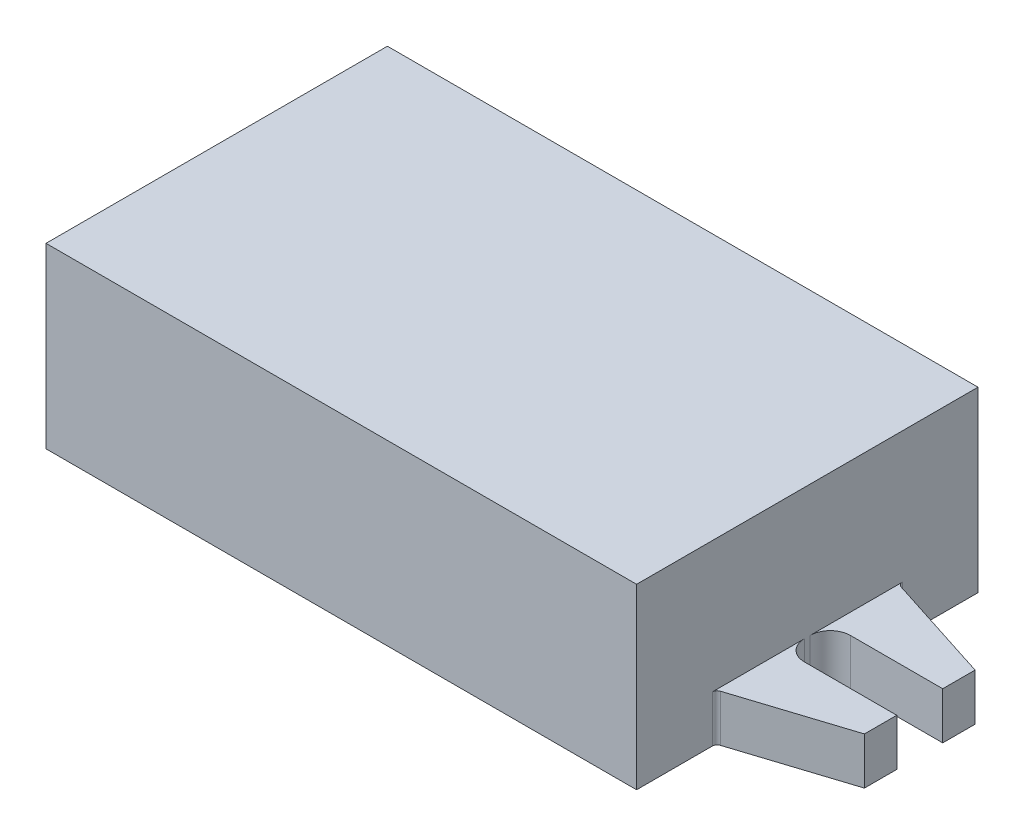
ISO-10303-21;
HEADER;
FILE_DESCRIPTION(('STEP AP214'),'2;1');
FILE_NAME('part.step','',(''),(''),'','','');
FILE_SCHEMA(('AUTOMOTIVE_DESIGN { 1 0 10303 214 1 1 1 1 }'));
ENDSEC;
DATA;
#1=APPLICATION_CONTEXT('core data for automotive mechanical design processes');
#2=APPLICATION_PROTOCOL_DEFINITION('international standard','automotive_design',2000,#1);
#3=PRODUCT_CONTEXT('',#1,'mechanical');
#4=PRODUCT('Part','Part','',(#3));
#5=PRODUCT_RELATED_PRODUCT_CATEGORY('part','',(#4));
#6=PRODUCT_DEFINITION_FORMATION('','',#4);
#7=PRODUCT_DEFINITION_CONTEXT('part definition',#1,'design');
#8=PRODUCT_DEFINITION('design','',#6,#7);
#9=PRODUCT_DEFINITION_SHAPE('','',#8);
#10=(LENGTH_UNIT() NAMED_UNIT(*) SI_UNIT(.MILLI.,.METRE.));
#11=(NAMED_UNIT(*) PLANE_ANGLE_UNIT() SI_UNIT($,.RADIAN.));
#12=(NAMED_UNIT(*) SI_UNIT($,.STERADIAN.) SOLID_ANGLE_UNIT());
#13=UNCERTAINTY_MEASURE_WITH_UNIT(LENGTH_MEASURE(1.E-05),#10,'distance_accuracy_value','');
#14=(GEOMETRIC_REPRESENTATION_CONTEXT(3) GLOBAL_UNCERTAINTY_ASSIGNED_CONTEXT((#13)) GLOBAL_UNIT_ASSIGNED_CONTEXT((#10,
#11,#12)) REPRESENTATION_CONTEXT('',''));
#15=CARTESIAN_POINT('',(0.,0.,0.));
#16=DIRECTION('',(0.,0.,1.));
#17=DIRECTION('',(1.,0.,0.));
#18=AXIS2_PLACEMENT_3D('',#15,#16,#17);
#19=CARTESIAN_POINT('',(46.736,3.683,-5.9451166944028));
#20=DIRECTION('',(0.,1.,0.));
#21=DIRECTION('',(0.,0.,1.));
#22=AXIS2_PLACEMENT_3D('',#19,#20,#21);
#23=PLANE('',#22);
#24=DIRECTION('',(0.,0.,1.));
#25=VECTOR('',#24,1.);
#26=CARTESIAN_POINT('',(0.,3.683,-26.797));
#27=LINE('',#26,#25);
#28=CARTESIAN_POINT('',(0.,3.683,-20.8518833055972));
#29=VERTEX_POINT('',#28);
#30=CARTESIAN_POINT('',(0.,3.683,-13.6271));
#31=VERTEX_POINT('',#30);
#32=EDGE_CURVE('E11',#29,#31,#27,.T.);
#33=ORIENTED_EDGE('',*,*,#32,.F.);
#34=CARTESIAN_POINT('',(-0.381,3.683,-20.8518833055972));
#35=DIRECTION('',(0.,-1.,0.));
#36=DIRECTION('',(0.,0.,1.));
#37=AXIS2_PLACEMENT_3D('',#34,#35,#36);
#38=CIRCLE('',#37,0.381000000000001);
#39=CARTESIAN_POINT('',(-0.264596381973705,3.683,-20.4891007292372));
#40=VERTEX_POINT('',#39);
#41=EDGE_CURVE('E402',#29,#40,#38,.T.);
#42=ORIENTED_EDGE('',*,*,#41,.T.);
#43=DIRECTION('',(-0.952185239789985,0.,0.305521307155636));
#44=VECTOR('',#43,1.);
#45=CARTESIAN_POINT('',(-8.82649999999999,3.683,-17.7419));
#46=LINE('',#45,#44);
#47=CARTESIAN_POINT('',(-8.82649999999999,3.683,-17.7419));
#48=VERTEX_POINT('',#47);
#49=EDGE_CURVE('E404',#40,#48,#46,.T.);
#50=ORIENTED_EDGE('',*,*,#49,.T.);
#51=DIRECTION('',(0.,0.,1.));
#52=VECTOR('',#51,1.);
#53=CARTESIAN_POINT('',(-8.82649999999999,3.683,-17.7419));
#54=LINE('',#53,#52);
#55=CARTESIAN_POINT('',(-8.82649999999999,3.683,-15.2019));
#56=VERTEX_POINT('',#55);
#57=EDGE_CURVE('E406',#48,#56,#54,.T.);
#58=ORIENTED_EDGE('',*,*,#57,.T.);
#59=DIRECTION('',(1.,0.,0.));
#60=VECTOR('',#59,1.);
#61=CARTESIAN_POINT('',(-8.82649999999999,3.683,-15.2019));
#62=LINE('',#61,#60);
#63=CARTESIAN_POINT('',(-1.57480000000001,3.683,-15.2019));
#64=VERTEX_POINT('',#63);
#65=EDGE_CURVE('E408',#56,#64,#62,.T.);
#66=ORIENTED_EDGE('',*,*,#65,.T.);
#67=CARTESIAN_POINT('',(-1.5748,3.683,-13.6271));
#68=DIRECTION('',(0.,-1.,0.));
#69=DIRECTION('',(0.,0.,-1.));
#70=AXIS2_PLACEMENT_3D('',#67,#68,#69);
#71=CIRCLE('',#70,1.5748);
#72=EDGE_CURVE('E410',#64,#31,#71,.T.);
#73=ORIENTED_EDGE('',*,*,#72,.T.);
#74=EDGE_LOOP('',(#33,#42,#50,#58,#66,#73));
#75=FACE_BOUND('',#74,.T.);
#76=ADVANCED_FACE('F33',(#75),#23,.T.);
#77=CARTESIAN_POINT('',(0.,3.683,-13.1699));
#78=VERTEX_POINT('',#77);
#79=CARTESIAN_POINT('',(0.,3.683,-5.9451166944028));
#80=VERTEX_POINT('',#79);
#81=EDGE_CURVE('E43',#78,#80,#27,.T.);
#82=ORIENTED_EDGE('',*,*,#81,.F.);
#83=CARTESIAN_POINT('',(-1.5748,3.683,-13.1699));
#84=DIRECTION('',(0.,-1.,0.));
#85=DIRECTION('',(0.,0.,1.));
#86=AXIS2_PLACEMENT_3D('',#83,#84,#85);
#87=CIRCLE('',#86,1.5748);
#88=CARTESIAN_POINT('',(-1.57480000000001,3.683,-11.5951));
#89=VERTEX_POINT('',#88);
#90=EDGE_CURVE('E412',#78,#89,#87,.T.);
#91=ORIENTED_EDGE('',*,*,#90,.T.);
#92=DIRECTION('',(-1.,0.,0.));
#93=VECTOR('',#92,1.);
#94=CARTESIAN_POINT('',(-8.82649999999999,3.683,-11.5951));
#95=LINE('',#94,#93);
#96=CARTESIAN_POINT('',(-8.82649999999999,3.683,-11.5951));
#97=VERTEX_POINT('',#96);
#98=EDGE_CURVE('E225',#89,#97,#95,.T.);
#99=ORIENTED_EDGE('',*,*,#98,.T.);
#100=DIRECTION('',(0.,0.,1.));
#101=VECTOR('',#100,1.);
#102=CARTESIAN_POINT('',(-8.82649999999999,3.683,-11.5951));
#103=LINE('',#102,#101);
#104=CARTESIAN_POINT('',(-8.82649999999999,3.683,-9.0551));
#105=VERTEX_POINT('',#104);
#106=EDGE_CURVE('E219',#97,#105,#103,.T.);
#107=ORIENTED_EDGE('',*,*,#106,.T.);
#108=DIRECTION('',(0.952185239789985,0.,0.305521307155636));
#109=VECTOR('',#108,1.);
#110=CARTESIAN_POINT('',(-8.82649999999999,3.683,-9.0551));
#111=LINE('',#110,#109);
#112=CARTESIAN_POINT('',(-0.264596381973705,3.683,-6.30789927076279));
#113=VERTEX_POINT('',#112);
#114=EDGE_CURVE('E223',#105,#113,#111,.T.);
#115=ORIENTED_EDGE('',*,*,#114,.T.);
#116=CARTESIAN_POINT('',(-0.381,3.683,-5.9451166944028));
#117=DIRECTION('',(0.,-1.,0.));
#118=DIRECTION('',(0.,0.,-1.));
#119=AXIS2_PLACEMENT_3D('',#116,#117,#118);
#120=CIRCLE('',#119,0.381);
#121=EDGE_CURVE('E52',#113,#80,#120,.T.);
#122=ORIENTED_EDGE('',*,*,#121,.T.);
#123=EDGE_LOOP('',(#82,#91,#99,#107,#115,#122));
#124=FACE_BOUND('',#123,.T.);
#125=ADVANCED_FACE('F221',(#124),#23,.T.);
#126=DIRECTION('',(0.,0.,-1.));
#127=VECTOR('',#126,1.);
#128=CARTESIAN_POINT('',(46.355,3.683,-26.797));
#129=LINE('',#128,#127);
#130=CARTESIAN_POINT('',(46.355,3.683,-5.9451166944028));
#131=VERTEX_POINT('',#130);
#132=CARTESIAN_POINT('',(46.355,3.683,-13.1699));
#133=VERTEX_POINT('',#132);
#134=EDGE_CURVE('E157',#131,#133,#129,.T.);
#135=ORIENTED_EDGE('',*,*,#134,.F.);
#136=CARTESIAN_POINT('',(46.736,3.683,-5.9451166944028));
#137=DIRECTION('',(0.,-1.,0.));
#138=DIRECTION('',(0.,0.,1.));
#139=AXIS2_PLACEMENT_3D('',#136,#137,#138);
#140=CIRCLE('',#139,0.381);
#141=CARTESIAN_POINT('',(46.6195963819737,3.683,-6.30789927076278));
#142=VERTEX_POINT('',#141);
#143=EDGE_CURVE('E298',#131,#142,#140,.T.);
#144=ORIENTED_EDGE('',*,*,#143,.T.);
#145=DIRECTION('',(0.952185239789985,0.,-0.305521307155636));
#146=VECTOR('',#145,1.);
#147=CARTESIAN_POINT('',(55.1815,3.683,-9.0551));
#148=LINE('',#147,#146);
#149=CARTESIAN_POINT('',(55.1815,3.683,-9.0551));
#150=VERTEX_POINT('',#149);
#151=EDGE_CURVE('E384',#142,#150,#148,.T.);
#152=ORIENTED_EDGE('',*,*,#151,.T.);
#153=DIRECTION('',(0.,0.,-1.));
#154=VECTOR('',#153,1.);
#155=CARTESIAN_POINT('',(55.1815,3.683,-11.5951));
#156=LINE('',#155,#154);
#157=CARTESIAN_POINT('',(55.1815,3.683,-11.5951));
#158=VERTEX_POINT('',#157);
#159=EDGE_CURVE('E386',#150,#158,#156,.T.);
#160=ORIENTED_EDGE('',*,*,#159,.T.);
#161=DIRECTION('',(-1.,0.,0.));
#162=VECTOR('',#161,1.);
#163=CARTESIAN_POINT('',(55.1815,3.683,-11.5951));
#164=LINE('',#163,#162);
#165=CARTESIAN_POINT('',(47.9298,3.683,-11.5951));
#166=VERTEX_POINT('',#165);
#167=EDGE_CURVE('E388',#158,#166,#164,.T.);
#168=ORIENTED_EDGE('',*,*,#167,.T.);
#169=CARTESIAN_POINT('',(47.9298,3.683,-13.1699));
#170=DIRECTION('',(0.,-1.,0.));
#171=DIRECTION('',(0.,0.,-1.));
#172=AXIS2_PLACEMENT_3D('',#169,#170,#171);
#173=CIRCLE('',#172,1.5748);
#174=EDGE_CURVE('E390',#166,#133,#173,.T.);
#175=ORIENTED_EDGE('',*,*,#174,.T.);
#176=EDGE_LOOP('',(#135,#144,#152,#160,#168,#175));
#177=FACE_BOUND('',#176,.T.);
#178=ADVANCED_FACE('F440',(#177),#23,.T.);
#179=CARTESIAN_POINT('',(0.,3.683,0.));
#180=DIRECTION('',(0.,0.,-1.));
#181=DIRECTION('',(-1.,0.,0.));
#182=AXIS2_PLACEMENT_3D('',#179,#180,#181);
#183=PLANE('',#182);
#184=DIRECTION('',(1.,0.,0.));
#185=VECTOR('',#184,1.);
#186=CARTESIAN_POINT('',(0.,0.,0.));
#187=LINE('',#186,#185);
#188=CARTESIAN_POINT('',(0.,0.,0.));
#189=VERTEX_POINT('',#188);
#190=CARTESIAN_POINT('',(46.355,0.,0.));
#191=VERTEX_POINT('',#190);
#192=EDGE_CURVE('E246',#189,#191,#187,.T.);
#193=ORIENTED_EDGE('',*,*,#192,.T.);
#194=DIRECTION('',(0.,-1.,0.));
#195=VECTOR('',#194,1.);
#196=CARTESIAN_POINT('',(46.355,3.683,0.));
#197=LINE('',#196,#195);
#198=CARTESIAN_POINT('',(46.355,13.97,0.));
#199=VERTEX_POINT('',#198);
#200=EDGE_CURVE('E367',#199,#191,#197,.T.);
#201=ORIENTED_EDGE('',*,*,#200,.F.);
#202=DIRECTION('',(1.,0.,0.));
#203=VECTOR('',#202,1.);
#204=CARTESIAN_POINT('',(0.,13.97,0.));
#205=LINE('',#204,#203);
#206=CARTESIAN_POINT('',(0.,13.97,0.));
#207=VERTEX_POINT('',#206);
#208=EDGE_CURVE('E463',#207,#199,#205,.T.);
#209=ORIENTED_EDGE('',*,*,#208,.F.);
#210=DIRECTION('',(0.,-1.,0.));
#211=VECTOR('',#210,1.);
#212=CARTESIAN_POINT('',(0.,3.683,0.));
#213=LINE('',#212,#211);
#214=EDGE_CURVE('E37',#207,#189,#213,.T.);
#215=ORIENTED_EDGE('',*,*,#214,.T.);
#216=EDGE_LOOP('',(#193,#201,#209,#215));
#217=FACE_BOUND('',#216,.T.);
#218=ADVANCED_FACE('F35',(#217),#183,.F.);
#219=CARTESIAN_POINT('',(46.736,3.683,-5.9451166944028));
#220=DIRECTION('',(0.,-1.,0.));
#221=DIRECTION('',(0.,0.,-1.));
#222=AXIS2_PLACEMENT_3D('',#219,#220,#221);
#223=CYLINDRICAL_SURFACE('',#222,0.381);
#224=CARTESIAN_POINT('',(46.736,0.,-5.9451166944028));
#225=DIRECTION('',(0.,-1.,0.));
#226=DIRECTION('',(0.,0.,1.));
#227=AXIS2_PLACEMENT_3D('',#224,#225,#226);
#228=CIRCLE('',#227,0.381);
#229=CARTESIAN_POINT('',(46.355,0.,-5.9451166944028));
#230=VERTEX_POINT('',#229);
#231=CARTESIAN_POINT('',(46.6195963819737,0.,-6.30789927076278));
#232=VERTEX_POINT('',#231);
#233=EDGE_CURVE('E251',#230,#232,#228,.T.);
#234=ORIENTED_EDGE('',*,*,#233,.T.);
#235=DIRECTION('',(0.,-1.,0.));
#236=VECTOR('',#235,1.);
#237=CARTESIAN_POINT('',(46.6195963819737,3.683,-6.30789927076278));
#238=LINE('',#237,#236);
#239=EDGE_CURVE('E362',#142,#232,#238,.T.);
#240=ORIENTED_EDGE('',*,*,#239,.F.);
#241=ORIENTED_EDGE('',*,*,#143,.F.);
#242=DIRECTION('',(0.,-1.,0.));
#243=VECTOR('',#242,1.);
#244=CARTESIAN_POINT('',(46.355,3.683,-5.9451166944028));
#245=LINE('',#244,#243);
#246=EDGE_CURVE('E365',#131,#230,#245,.T.);
#247=ORIENTED_EDGE('',*,*,#246,.T.);
#248=EDGE_LOOP('',(#234,#240,#241,#247));
#249=FACE_BOUND('',#248,.T.);
#250=ADVANCED_FACE('F556',(#249),#223,.F.);
#251=CARTESIAN_POINT('',(55.1815,3.683,-9.0551));
#252=DIRECTION('',(-0.305521307155636,0.,-0.952185239789985));
#253=DIRECTION('',(-0.952185239789985,0.,0.305521307155636));
#254=AXIS2_PLACEMENT_3D('',#251,#252,#253);
#255=PLANE('',#254);
#256=DIRECTION('',(0.952185239789985,0.,-0.305521307155636));
#257=VECTOR('',#256,1.);
#258=CARTESIAN_POINT('',(55.1815,0.,-9.0551));
#259=LINE('',#258,#257);
#260=CARTESIAN_POINT('',(55.1815,0.,-9.0551));
#261=VERTEX_POINT('',#260);
#262=EDGE_CURVE('E253',#232,#261,#259,.T.);
#263=ORIENTED_EDGE('',*,*,#262,.T.);
#264=DIRECTION('',(0.,-1.,0.));
#265=VECTOR('',#264,1.);
#266=CARTESIAN_POINT('',(55.1815,3.683,-9.0551));
#267=LINE('',#266,#265);
#268=EDGE_CURVE('E359',#150,#261,#267,.T.);
#269=ORIENTED_EDGE('',*,*,#268,.F.);
#270=ORIENTED_EDGE('',*,*,#151,.F.);
#271=ORIENTED_EDGE('',*,*,#239,.T.);
#272=EDGE_LOOP('',(#263,#269,#270,#271));
#273=FACE_BOUND('',#272,.T.);
#274=ADVANCED_FACE('F553',(#273),#255,.F.);
#275=CARTESIAN_POINT('',(55.1815,3.683,-11.5951));
#276=DIRECTION('',(-1.,0.,0.));
#277=DIRECTION('',(0.,0.,1.));
#278=AXIS2_PLACEMENT_3D('',#275,#276,#277);
#279=PLANE('',#278);
#280=DIRECTION('',(0.,0.,-1.));
#281=VECTOR('',#280,1.);
#282=CARTESIAN_POINT('',(55.1815,0.,-11.5951));
#283=LINE('',#282,#281);
#284=CARTESIAN_POINT('',(55.1815,0.,-11.5951));
#285=VERTEX_POINT('',#284);
#286=EDGE_CURVE('E255',#261,#285,#283,.T.);
#287=ORIENTED_EDGE('',*,*,#286,.T.);
#288=DIRECTION('',(0.,-1.,0.));
#289=VECTOR('',#288,1.);
#290=CARTESIAN_POINT('',(55.1815,3.683,-11.5951));
#291=LINE('',#290,#289);
#292=EDGE_CURVE('E356',#158,#285,#291,.T.);
#293=ORIENTED_EDGE('',*,*,#292,.F.);
#294=ORIENTED_EDGE('',*,*,#159,.F.);
#295=ORIENTED_EDGE('',*,*,#268,.T.);
#296=EDGE_LOOP('',(#287,#293,#294,#295));
#297=FACE_BOUND('',#296,.T.);
#298=ADVANCED_FACE('F549',(#297),#279,.F.);
#299=CARTESIAN_POINT('',(55.1815,3.683,-11.5951));
#300=DIRECTION('',(0.,0.,1.));
#301=DIRECTION('',(1.,0.,0.));
#302=AXIS2_PLACEMENT_3D('',#299,#300,#301);
#303=PLANE('',#302);
#304=DIRECTION('',(-1.,0.,0.));
#305=VECTOR('',#304,1.);
#306=CARTESIAN_POINT('',(55.1815,0.,-11.5951));
#307=LINE('',#306,#305);
#308=CARTESIAN_POINT('',(47.9298,0.,-11.5951));
#309=VERTEX_POINT('',#308);
#310=EDGE_CURVE('E257',#285,#309,#307,.T.);
#311=ORIENTED_EDGE('',*,*,#310,.T.);
#312=DIRECTION('',(0.,-1.,0.));
#313=VECTOR('',#312,1.);
#314=CARTESIAN_POINT('',(47.9298,3.683,-11.5951));
#315=LINE('',#314,#313);
#316=EDGE_CURVE('E353',#166,#309,#315,.T.);
#317=ORIENTED_EDGE('',*,*,#316,.F.);
#318=ORIENTED_EDGE('',*,*,#167,.F.);
#319=ORIENTED_EDGE('',*,*,#292,.T.);
#320=EDGE_LOOP('',(#311,#317,#318,#319));
#321=FACE_BOUND('',#320,.T.);
#322=ADVANCED_FACE('F545',(#321),#303,.F.);
#323=CARTESIAN_POINT('',(47.9298,3.683,-13.1699));
#324=DIRECTION('',(0.,-1.,0.));
#325=DIRECTION('',(0.,0.,-1.));
#326=AXIS2_PLACEMENT_3D('',#323,#324,#325);
#327=CYLINDRICAL_SURFACE('',#326,1.5748);
#328=CARTESIAN_POINT('',(47.9298,0.,-13.1699));
#329=DIRECTION('',(0.,-1.,0.));
#330=DIRECTION('',(0.,0.,-1.));
#331=AXIS2_PLACEMENT_3D('',#328,#329,#330);
#332=CIRCLE('',#331,1.5748);
#333=CARTESIAN_POINT('',(46.355,0.,-13.1699));
#334=VERTEX_POINT('',#333);
#335=EDGE_CURVE('E259',#309,#334,#332,.T.);
#336=ORIENTED_EDGE('',*,*,#335,.T.);
#337=DIRECTION('',(0.,-1.,0.));
#338=VECTOR('',#337,1.);
#339=CARTESIAN_POINT('',(46.355,3.683,-13.1699));
#340=LINE('',#339,#338);
#341=EDGE_CURVE('E350',#133,#334,#340,.T.);
#342=ORIENTED_EDGE('',*,*,#341,.F.);
#343=ORIENTED_EDGE('',*,*,#174,.F.);
#344=ORIENTED_EDGE('',*,*,#316,.T.);
#345=EDGE_LOOP('',(#336,#342,#343,#344));
#346=FACE_BOUND('',#345,.T.);
#347=ADVANCED_FACE('F541',(#346),#327,.F.);
#348=CARTESIAN_POINT('',(47.9298,3.683,-13.6271));
#349=DIRECTION('',(0.,-1.,0.));
#350=DIRECTION('',(0.,0.,-1.));
#351=AXIS2_PLACEMENT_3D('',#348,#349,#350);
#352=CYLINDRICAL_SURFACE('',#351,1.5748);
#353=CARTESIAN_POINT('',(47.9298,0.,-13.6271));
#354=DIRECTION('',(0.,-1.,0.));
#355=DIRECTION('',(0.,0.,1.));
#356=AXIS2_PLACEMENT_3D('',#353,#354,#355);
#357=CIRCLE('',#356,1.5748);
#358=CARTESIAN_POINT('',(46.355,0.,-13.6271));
#359=VERTEX_POINT('',#358);
#360=CARTESIAN_POINT('',(47.9298,0.,-15.2019));
#361=VERTEX_POINT('',#360);
#362=EDGE_CURVE('E263',#359,#361,#357,.T.);
#363=ORIENTED_EDGE('',*,*,#362,.T.);
#364=DIRECTION('',(0.,-1.,0.));
#365=VECTOR('',#364,1.);
#366=CARTESIAN_POINT('',(47.9298,3.683,-15.2019));
#367=LINE('',#366,#365);
#368=CARTESIAN_POINT('',(47.9298,3.683,-15.2019));
#369=VERTEX_POINT('',#368);
#370=EDGE_CURVE('E344',#369,#361,#367,.T.);
#371=ORIENTED_EDGE('',*,*,#370,.F.);
#372=CARTESIAN_POINT('',(47.9298,3.683,-13.6271));
#373=DIRECTION('',(0.,-1.,0.));
#374=DIRECTION('',(0.,0.,1.));
#375=AXIS2_PLACEMENT_3D('',#372,#373,#374);
#376=CIRCLE('',#375,1.5748);
#377=CARTESIAN_POINT('',(46.355,3.683,-13.6271));
#378=VERTEX_POINT('',#377);
#379=EDGE_CURVE('E392',#378,#369,#376,.T.);
#380=ORIENTED_EDGE('',*,*,#379,.F.);
#381=DIRECTION('',(0.,-1.,0.));
#382=VECTOR('',#381,1.);
#383=CARTESIAN_POINT('',(46.355,3.683,-13.6271));
#384=LINE('',#383,#382);
#385=EDGE_CURVE('E347',#378,#359,#384,.T.);
#386=ORIENTED_EDGE('',*,*,#385,.T.);
#387=EDGE_LOOP('',(#363,#371,#380,#386));
#388=FACE_BOUND('',#387,.T.);
#389=ADVANCED_FACE('F537',(#388),#352,.F.);
#390=CARTESIAN_POINT('',(47.9298,3.683,-15.2019));
#391=DIRECTION('',(0.,0.,-1.));
#392=DIRECTION('',(-1.,0.,0.));
#393=AXIS2_PLACEMENT_3D('',#390,#391,#392);
#394=PLANE('',#393);
#395=DIRECTION('',(1.,0.,0.));
#396=VECTOR('',#395,1.);
#397=CARTESIAN_POINT('',(47.9298,0.,-15.2019));
#398=LINE('',#397,#396);
#399=CARTESIAN_POINT('',(55.1815,0.,-15.2019));
#400=VERTEX_POINT('',#399);
#401=EDGE_CURVE('E265',#361,#400,#398,.T.);
#402=ORIENTED_EDGE('',*,*,#401,.T.);
#403=DIRECTION('',(0.,-1.,0.));
#404=VECTOR('',#403,1.);
#405=CARTESIAN_POINT('',(55.1815,3.683,-15.2019));
#406=LINE('',#405,#404);
#407=CARTESIAN_POINT('',(55.1815,3.683,-15.2019));
#408=VERTEX_POINT('',#407);
#409=EDGE_CURVE('E341',#408,#400,#406,.T.);
#410=ORIENTED_EDGE('',*,*,#409,.F.);
#411=DIRECTION('',(1.,0.,0.));
#412=VECTOR('',#411,1.);
#413=CARTESIAN_POINT('',(47.9298,3.683,-15.2019));
#414=LINE('',#413,#412);
#415=EDGE_CURVE('E394',#369,#408,#414,.T.);
#416=ORIENTED_EDGE('',*,*,#415,.F.);
#417=ORIENTED_EDGE('',*,*,#370,.T.);
#418=EDGE_LOOP('',(#402,#410,#416,#417));
#419=FACE_BOUND('',#418,.T.);
#420=ADVANCED_FACE('F533',(#419),#394,.F.);
#421=CARTESIAN_POINT('',(55.1815,3.683,-17.7419));
#422=DIRECTION('',(-1.,0.,0.));
#423=DIRECTION('',(0.,0.,1.));
#424=AXIS2_PLACEMENT_3D('',#421,#422,#423);
#425=PLANE('',#424);
#426=DIRECTION('',(0.,0.,-1.));
#427=VECTOR('',#426,1.);
#428=CARTESIAN_POINT('',(55.1815,0.,-17.7419));
#429=LINE('',#428,#427);
#430=CARTESIAN_POINT('',(55.1815,0.,-17.7419));
#431=VERTEX_POINT('',#430);
#432=EDGE_CURVE('E267',#400,#431,#429,.T.);
#433=ORIENTED_EDGE('',*,*,#432,.T.);
#434=DIRECTION('',(0.,-1.,0.));
#435=VECTOR('',#434,1.);
#436=CARTESIAN_POINT('',(55.1815,3.683,-17.7419));
#437=LINE('',#436,#435);
#438=CARTESIAN_POINT('',(55.1815,3.683,-17.7419));
#439=VERTEX_POINT('',#438);
#440=EDGE_CURVE('E338',#439,#431,#437,.T.);
#441=ORIENTED_EDGE('',*,*,#440,.F.);
#442=DIRECTION('',(0.,0.,-1.));
#443=VECTOR('',#442,1.);
#444=CARTESIAN_POINT('',(55.1815,3.683,-17.7419));
#445=LINE('',#444,#443);
#446=EDGE_CURVE('E396',#408,#439,#445,.T.);
#447=ORIENTED_EDGE('',*,*,#446,.F.);
#448=ORIENTED_EDGE('',*,*,#409,.T.);
#449=EDGE_LOOP('',(#433,#441,#447,#448));
#450=FACE_BOUND('',#449,.T.);
#451=ADVANCED_FACE('F529',(#450),#425,.F.);
#452=CARTESIAN_POINT('',(55.1815,3.683,-17.7419));
#453=DIRECTION('',(-0.305521307155636,0.,0.952185239789985));
#454=DIRECTION('',(0.952185239789985,0.,0.305521307155636));
#455=AXIS2_PLACEMENT_3D('',#452,#453,#454);
#456=PLANE('',#455);
#457=DIRECTION('',(-0.952185239789985,0.,-0.305521307155636));
#458=VECTOR('',#457,1.);
#459=CARTESIAN_POINT('',(55.1815,0.,-17.7419));
#460=LINE('',#459,#458);
#461=CARTESIAN_POINT('',(46.6195963819737,0.,-20.4891007292372));
#462=VERTEX_POINT('',#461);
#463=EDGE_CURVE('E269',#431,#462,#460,.T.);
#464=ORIENTED_EDGE('',*,*,#463,.T.);
#465=DIRECTION('',(0.,-1.,0.));
#466=VECTOR('',#465,1.);
#467=CARTESIAN_POINT('',(46.6195963819737,3.683,-20.4891007292372));
#468=LINE('',#467,#466);
#469=CARTESIAN_POINT('',(46.6195963819737,3.683,-20.4891007292372));
#470=VERTEX_POINT('',#469);
#471=EDGE_CURVE('E335',#470,#462,#468,.T.);
#472=ORIENTED_EDGE('',*,*,#471,.F.);
#473=DIRECTION('',(-0.952185239789985,0.,-0.305521307155636));
#474=VECTOR('',#473,1.);
#475=CARTESIAN_POINT('',(55.1815,3.683,-17.7419));
#476=LINE('',#475,#474);
#477=EDGE_CURVE('E398',#439,#470,#476,.T.);
#478=ORIENTED_EDGE('',*,*,#477,.F.);
#479=ORIENTED_EDGE('',*,*,#440,.T.);
#480=EDGE_LOOP('',(#464,#472,#478,#479));
#481=FACE_BOUND('',#480,.T.);
#482=ADVANCED_FACE('F525',(#481),#456,.F.);
#483=CARTESIAN_POINT('',(46.736,3.683,-20.8518833055972));
#484=DIRECTION('',(0.,-1.,0.));
#485=DIRECTION('',(0.,0.,-1.));
#486=AXIS2_PLACEMENT_3D('',#483,#484,#485);
#487=CYLINDRICAL_SURFACE('',#486,0.381000000000001);
#488=CARTESIAN_POINT('',(46.736,0.,-20.8518833055972));
#489=DIRECTION('',(0.,-1.,0.));
#490=DIRECTION('',(0.,0.,-1.));
#491=AXIS2_PLACEMENT_3D('',#488,#489,#490);
#492=CIRCLE('',#491,0.381000000000001);
#493=CARTESIAN_POINT('',(46.355,0.,-20.8518833055972));
#494=VERTEX_POINT('',#493);
#495=EDGE_CURVE('E271',#462,#494,#492,.T.);
#496=ORIENTED_EDGE('',*,*,#495,.T.);
#497=DIRECTION('',(0.,-1.,0.));
#498=VECTOR('',#497,1.);
#499=CARTESIAN_POINT('',(46.355,3.683,-20.8518833055972));
#500=LINE('',#499,#498);
#501=CARTESIAN_POINT('',(46.355,3.683,-20.8518833055972));
#502=VERTEX_POINT('',#501);
#503=EDGE_CURVE('E332',#502,#494,#500,.T.);
#504=ORIENTED_EDGE('',*,*,#503,.F.);
#505=CARTESIAN_POINT('',(46.736,3.683,-20.8518833055972));
#506=DIRECTION('',(0.,-1.,0.));
#507=DIRECTION('',(0.,0.,-1.));
#508=AXIS2_PLACEMENT_3D('',#505,#506,#507);
#509=CIRCLE('',#508,0.381000000000001);
#510=EDGE_CURVE('E400',#470,#502,#509,.T.);
#511=ORIENTED_EDGE('',*,*,#510,.F.);
#512=ORIENTED_EDGE('',*,*,#471,.T.);
#513=EDGE_LOOP('',(#496,#504,#511,#512));
#514=FACE_BOUND('',#513,.T.);
#515=ADVANCED_FACE('F522',(#514),#487,.F.);
#516=CARTESIAN_POINT('',(46.355,3.683,-20.8518833055972));
#517=DIRECTION('',(-1.,0.,0.));
#518=DIRECTION('',(0.,0.,1.));
#519=AXIS2_PLACEMENT_3D('',#516,#517,#518);
#520=PLANE('',#519);
#521=DIRECTION('',(0.,0.,-1.));
#522=VECTOR('',#521,1.);
#523=CARTESIAN_POINT('',(46.355,0.,-20.8518833055972));
#524=LINE('',#523,#522);
#525=CARTESIAN_POINT('',(46.355,0.,-26.797));
#526=VERTEX_POINT('',#525);
#527=EDGE_CURVE('E273',#494,#526,#524,.T.);
#528=ORIENTED_EDGE('',*,*,#527,.T.);
#529=DIRECTION('',(0.,-1.,0.));
#530=VECTOR('',#529,1.);
#531=CARTESIAN_POINT('',(46.355,3.683,-26.797));
#532=LINE('',#531,#530);
#533=CARTESIAN_POINT('',(46.355,13.97,-26.797));
#534=VERTEX_POINT('',#533);
#535=EDGE_CURVE('E329',#534,#526,#532,.T.);
#536=ORIENTED_EDGE('',*,*,#535,.F.);
#537=DIRECTION('',(0.,0.,-1.));
#538=VECTOR('',#537,1.);
#539=CARTESIAN_POINT('',(46.355,13.97,-26.797));
#540=LINE('',#539,#538);
#541=EDGE_CURVE('E467',#199,#534,#540,.T.);
#542=ORIENTED_EDGE('',*,*,#541,.F.);
#543=ORIENTED_EDGE('',*,*,#200,.T.);
#544=DIRECTION('',(0.,0.,-1.));
#545=VECTOR('',#544,1.);
#546=CARTESIAN_POINT('',(46.355,0.,-5.9451166944028));
#547=LINE('',#546,#545);
#548=EDGE_CURVE('E249',#191,#230,#547,.T.);
#549=ORIENTED_EDGE('',*,*,#548,.T.);
#550=ORIENTED_EDGE('',*,*,#246,.F.);
#551=ORIENTED_EDGE('',*,*,#134,.T.);
#552=ORIENTED_EDGE('',*,*,#341,.T.);
#553=DIRECTION('',(0.,0.,-1.));
#554=VECTOR('',#553,1.);
#555=CARTESIAN_POINT('',(46.355,0.,-13.1699));
#556=LINE('',#555,#554);
#557=EDGE_CURVE('E261',#334,#359,#556,.T.);
#558=ORIENTED_EDGE('',*,*,#557,.T.);
#559=ORIENTED_EDGE('',*,*,#385,.F.);
#560=EDGE_CURVE('E374',#378,#502,#129,.T.);
#561=ORIENTED_EDGE('',*,*,#560,.T.);
#562=ORIENTED_EDGE('',*,*,#503,.T.);
#563=EDGE_LOOP('',(#528,#536,#542,#543,#549,#550,#551,#552,#558,#559,#561,#562));
#564=FACE_BOUND('',#563,.T.);
#565=ADVANCED_FACE('F519',(#564),#520,.F.);
#566=CARTESIAN_POINT('',(0.,3.683,-26.797));
#567=DIRECTION('',(0.,0.,1.));
#568=DIRECTION('',(1.,0.,0.));
#569=AXIS2_PLACEMENT_3D('',#566,#567,#568);
#570=PLANE('',#569);
#571=DIRECTION('',(-1.,0.,0.));
#572=VECTOR('',#571,1.);
#573=CARTESIAN_POINT('',(0.,0.,-26.797));
#574=LINE('',#573,#572);
#575=CARTESIAN_POINT('',(0.,0.,-26.797));
#576=VERTEX_POINT('',#575);
#577=EDGE_CURVE('E275',#526,#576,#574,.T.);
#578=ORIENTED_EDGE('',*,*,#577,.T.);
#579=DIRECTION('',(0.,-1.,0.));
#580=VECTOR('',#579,1.);
#581=CARTESIAN_POINT('',(0.,3.683,-26.797));
#582=LINE('',#581,#580);
#583=CARTESIAN_POINT('',(0.,13.97,-26.797));
#584=VERTEX_POINT('',#583);
#585=EDGE_CURVE('E326',#584,#576,#582,.T.);
#586=ORIENTED_EDGE('',*,*,#585,.F.);
#587=DIRECTION('',(-1.,0.,0.));
#588=VECTOR('',#587,1.);
#589=CARTESIAN_POINT('',(0.,13.97,-26.797));
#590=LINE('',#589,#588);
#591=EDGE_CURVE('E247',#534,#584,#590,.T.);
#592=ORIENTED_EDGE('',*,*,#591,.F.);
#593=ORIENTED_EDGE('',*,*,#535,.T.);
#594=EDGE_LOOP('',(#578,#586,#592,#593));
#595=FACE_BOUND('',#594,.T.);
#596=ADVANCED_FACE('F474',(#595),#570,.F.);
#597=CARTESIAN_POINT('',(-0.381,3.683,-20.8518833055972));
#598=DIRECTION('',(0.,-1.,0.));
#599=DIRECTION('',(0.,0.,-1.));
#600=AXIS2_PLACEMENT_3D('',#597,#598,#599);
#601=CYLINDRICAL_SURFACE('',#600,0.381000000000001);
#602=CARTESIAN_POINT('',(-0.381,0.,-20.8518833055972));
#603=DIRECTION('',(0.,-1.,0.));
#604=DIRECTION('',(0.,0.,1.));
#605=AXIS2_PLACEMENT_3D('',#602,#603,#604);
#606=CIRCLE('',#605,0.381000000000001);
#607=CARTESIAN_POINT('',(0.,0.,-20.8518833055972));
#608=VERTEX_POINT('',#607);
#609=CARTESIAN_POINT('',(-0.264596381973705,0.,-20.4891007292372));
#610=VERTEX_POINT('',#609);
#611=EDGE_CURVE('E279',#608,#610,#606,.T.);
#612=ORIENTED_EDGE('',*,*,#611,.T.);
#613=DIRECTION('',(0.,-1.,0.));
#614=VECTOR('',#613,1.);
#615=CARTESIAN_POINT('',(-0.264596381973705,3.683,-20.4891007292372));
#616=LINE('',#615,#614);
#617=EDGE_CURVE('E320',#40,#610,#616,.T.);
#618=ORIENTED_EDGE('',*,*,#617,.F.);
#619=ORIENTED_EDGE('',*,*,#41,.F.);
#620=DIRECTION('',(0.,-1.,0.));
#621=VECTOR('',#620,1.);
#622=CARTESIAN_POINT('',(0.,3.683,-20.8518833055972));
#623=LINE('',#622,#621);
#624=EDGE_CURVE('E323',#29,#608,#623,.T.);
#625=ORIENTED_EDGE('',*,*,#624,.T.);
#626=EDGE_LOOP('',(#612,#618,#619,#625));
#627=FACE_BOUND('',#626,.T.);
#628=ADVANCED_FACE('F484',(#627),#601,.F.);
#629=CARTESIAN_POINT('',(-8.82649999999999,3.683,-17.7419));
#630=DIRECTION('',(0.305521307155636,0.,0.952185239789985));
#631=DIRECTION('',(0.952185239789985,0.,-0.305521307155636));
#632=AXIS2_PLACEMENT_3D('',#629,#630,#631);
#633=PLANE('',#632);
#634=DIRECTION('',(-0.952185239789985,0.,0.305521307155636));
#635=VECTOR('',#634,1.);
#636=CARTESIAN_POINT('',(-8.82649999999999,0.,-17.7419));
#637=LINE('',#636,#635);
#638=CARTESIAN_POINT('',(-8.82649999999999,0.,-17.7419));
#639=VERTEX_POINT('',#638);
#640=EDGE_CURVE('E281',#610,#639,#637,.T.);
#641=ORIENTED_EDGE('',*,*,#640,.T.);
#642=DIRECTION('',(0.,-1.,0.));
#643=VECTOR('',#642,1.);
#644=CARTESIAN_POINT('',(-8.82649999999999,3.683,-17.7419));
#645=LINE('',#644,#643);
#646=EDGE_CURVE('E317',#48,#639,#645,.T.);
#647=ORIENTED_EDGE('',*,*,#646,.F.);
#648=ORIENTED_EDGE('',*,*,#49,.F.);
#649=ORIENTED_EDGE('',*,*,#617,.T.);
#650=EDGE_LOOP('',(#641,#647,#648,#649));
#651=FACE_BOUND('',#650,.T.);
#652=ADVANCED_FACE('F488',(#651),#633,.F.);
#653=CARTESIAN_POINT('',(-8.82649999999999,3.683,-17.7419));
#654=DIRECTION('',(1.,0.,0.));
#655=DIRECTION('',(0.,0.,-1.));
#656=AXIS2_PLACEMENT_3D('',#653,#654,#655);
#657=PLANE('',#656);
#658=DIRECTION('',(0.,0.,1.));
#659=VECTOR('',#658,1.);
#660=CARTESIAN_POINT('',(-8.82649999999999,0.,-17.7419));
#661=LINE('',#660,#659);
#662=CARTESIAN_POINT('',(-8.82649999999999,0.,-15.2019));
#663=VERTEX_POINT('',#662);
#664=EDGE_CURVE('E283',#639,#663,#661,.T.);
#665=ORIENTED_EDGE('',*,*,#664,.T.);
#666=DIRECTION('',(0.,-1.,0.));
#667=VECTOR('',#666,1.);
#668=CARTESIAN_POINT('',(-8.82649999999999,3.683,-15.2019));
#669=LINE('',#668,#667);
#670=EDGE_CURVE('E314',#56,#663,#669,.T.);
#671=ORIENTED_EDGE('',*,*,#670,.F.);
#672=ORIENTED_EDGE('',*,*,#57,.F.);
#673=ORIENTED_EDGE('',*,*,#646,.T.);
#674=EDGE_LOOP('',(#665,#671,#672,#673));
#675=FACE_BOUND('',#674,.T.);
#676=ADVANCED_FACE('F504',(#675),#657,.F.);
#677=CARTESIAN_POINT('',(-8.82649999999999,3.683,-15.2019));
#678=DIRECTION('',(0.,0.,-1.));
#679=DIRECTION('',(-1.,0.,0.));
#680=AXIS2_PLACEMENT_3D('',#677,#678,#679);
#681=PLANE('',#680);
#682=DIRECTION('',(1.,0.,0.));
#683=VECTOR('',#682,1.);
#684=CARTESIAN_POINT('',(-8.82649999999999,0.,-15.2019));
#685=LINE('',#684,#683);
#686=CARTESIAN_POINT('',(-1.57480000000001,0.,-15.2019));
#687=VERTEX_POINT('',#686);
#688=EDGE_CURVE('E285',#663,#687,#685,.T.);
#689=ORIENTED_EDGE('',*,*,#688,.T.);
#690=DIRECTION('',(0.,-1.,0.));
#691=VECTOR('',#690,1.);
#692=CARTESIAN_POINT('',(-1.57480000000001,3.683,-15.2019));
#693=LINE('',#692,#691);
#694=EDGE_CURVE('E311',#64,#687,#693,.T.);
#695=ORIENTED_EDGE('',*,*,#694,.F.);
#696=ORIENTED_EDGE('',*,*,#65,.F.);
#697=ORIENTED_EDGE('',*,*,#670,.T.);
#698=EDGE_LOOP('',(#689,#695,#696,#697));
#699=FACE_BOUND('',#698,.T.);
#700=ADVANCED_FACE('F502',(#699),#681,.F.);
#701=CARTESIAN_POINT('',(-1.5748,3.683,-13.6271));
#702=DIRECTION('',(0.,-1.,0.));
#703=DIRECTION('',(0.,0.,-1.));
#704=AXIS2_PLACEMENT_3D('',#701,#702,#703);
#705=CYLINDRICAL_SURFACE('',#704,1.5748);
#706=CARTESIAN_POINT('',(-1.5748,0.,-13.6271));
#707=DIRECTION('',(0.,-1.,0.));
#708=DIRECTION('',(0.,0.,-1.));
#709=AXIS2_PLACEMENT_3D('',#706,#707,#708);
#710=CIRCLE('',#709,1.5748);
#711=CARTESIAN_POINT('',(0.,0.,-13.6271));
#712=VERTEX_POINT('',#711);
#713=EDGE_CURVE('E287',#687,#712,#710,.T.);
#714=ORIENTED_EDGE('',*,*,#713,.T.);
#715=DIRECTION('',(0.,-1.,0.));
#716=VECTOR('',#715,1.);
#717=CARTESIAN_POINT('',(0.,3.683,-13.6271));
#718=LINE('',#717,#716);
#719=EDGE_CURVE('E308',#31,#712,#718,.T.);
#720=ORIENTED_EDGE('',*,*,#719,.F.);
#721=ORIENTED_EDGE('',*,*,#72,.F.);
#722=ORIENTED_EDGE('',*,*,#694,.T.);
#723=EDGE_LOOP('',(#714,#720,#721,#722));
#724=FACE_BOUND('',#723,.T.);
#725=ADVANCED_FACE('F498',(#724),#705,.F.);
#726=CARTESIAN_POINT('',(0.,3.683,-13.1699));
#727=DIRECTION('',(1.,0.,0.));
#728=DIRECTION('',(0.,0.,-1.));
#729=AXIS2_PLACEMENT_3D('',#726,#727,#728);
#730=PLANE('',#729);
#731=DIRECTION('',(0.,0.,1.));
#732=VECTOR('',#731,1.);
#733=CARTESIAN_POINT('',(0.,0.,-13.1699));
#734=LINE('',#733,#732);
#735=CARTESIAN_POINT('',(0.,0.,-13.1699));
#736=VERTEX_POINT('',#735);
#737=EDGE_CURVE('E289',#712,#736,#734,.T.);
#738=ORIENTED_EDGE('',*,*,#737,.T.);
#739=DIRECTION('',(0.,-1.,0.));
#740=VECTOR('',#739,1.);
#741=CARTESIAN_POINT('',(0.,3.683,-13.1699));
#742=LINE('',#741,#740);
#743=EDGE_CURVE('E305',#78,#736,#742,.T.);
#744=ORIENTED_EDGE('',*,*,#743,.F.);
#745=ORIENTED_EDGE('',*,*,#81,.T.);
#746=DIRECTION('',(0.,-1.,0.));
#747=VECTOR('',#746,1.);
#748=CARTESIAN_POINT('',(0.,3.683,-5.9451166944028));
#749=LINE('',#748,#747);
#750=CARTESIAN_POINT('',(0.,0.,-5.9451166944028));
#751=VERTEX_POINT('',#750);
#752=EDGE_CURVE('E239',#80,#751,#749,.T.);
#753=ORIENTED_EDGE('',*,*,#752,.T.);
#754=DIRECTION('',(0.,0.,1.));
#755=VECTOR('',#754,1.);
#756=CARTESIAN_POINT('',(0.,0.,-5.9451166944028));
#757=LINE('',#756,#755);
#758=EDGE_CURVE('E243',#751,#189,#757,.T.);
#759=ORIENTED_EDGE('',*,*,#758,.T.);
#760=ORIENTED_EDGE('',*,*,#214,.F.);
#761=DIRECTION('',(0.,0.,1.));
#762=VECTOR('',#761,1.);
#763=CARTESIAN_POINT('',(0.,13.97,-26.797));
#764=LINE('',#763,#762);
#765=EDGE_CURVE('E460',#584,#207,#764,.T.);
#766=ORIENTED_EDGE('',*,*,#765,.F.);
#767=ORIENTED_EDGE('',*,*,#585,.T.);
#768=DIRECTION('',(0.,0.,1.));
#769=VECTOR('',#768,1.);
#770=CARTESIAN_POINT('',(0.,0.,-26.797));
#771=LINE('',#770,#769);
#772=EDGE_CURVE('E277',#576,#608,#771,.T.);
#773=ORIENTED_EDGE('',*,*,#772,.T.);
#774=ORIENTED_EDGE('',*,*,#624,.F.);
#775=ORIENTED_EDGE('',*,*,#32,.T.);
#776=ORIENTED_EDGE('',*,*,#719,.T.);
#777=EDGE_LOOP('',(#738,#744,#745,#753,#759,#760,#766,#767,#773,#774,#775,#776));
#778=FACE_BOUND('',#777,.T.);
#779=ADVANCED_FACE('F427',(#778),#730,.F.);
#780=CARTESIAN_POINT('',(-1.5748,3.683,-13.1699));
#781=DIRECTION('',(0.,-1.,0.));
#782=DIRECTION('',(0.,0.,-1.));
#783=AXIS2_PLACEMENT_3D('',#780,#781,#782);
#784=CYLINDRICAL_SURFACE('',#783,1.5748);
#785=CARTESIAN_POINT('',(-1.5748,0.,-13.1699));
#786=DIRECTION('',(0.,-1.,0.));
#787=DIRECTION('',(0.,0.,1.));
#788=AXIS2_PLACEMENT_3D('',#785,#786,#787);
#789=CIRCLE('',#788,1.5748);
#790=CARTESIAN_POINT('',(-1.57480000000001,0.,-11.5951));
#791=VERTEX_POINT('',#790);
#792=EDGE_CURVE('E291',#736,#791,#789,.T.);
#793=ORIENTED_EDGE('',*,*,#792,.T.);
#794=DIRECTION('',(0.,-1.,0.));
#795=VECTOR('',#794,1.);
#796=CARTESIAN_POINT('',(-1.57480000000001,3.683,-11.5951));
#797=LINE('',#796,#795);
#798=EDGE_CURVE('E302',#89,#791,#797,.T.);
#799=ORIENTED_EDGE('',*,*,#798,.F.);
#800=ORIENTED_EDGE('',*,*,#90,.F.);
#801=ORIENTED_EDGE('',*,*,#743,.T.);
#802=EDGE_LOOP('',(#793,#799,#800,#801));
#803=FACE_BOUND('',#802,.T.);
#804=ADVANCED_FACE('F418',(#803),#784,.F.);
#805=CARTESIAN_POINT('',(-8.82649999999999,3.683,-11.5951));
#806=DIRECTION('',(0.,0.,1.));
#807=DIRECTION('',(1.,0.,0.));
#808=AXIS2_PLACEMENT_3D('',#805,#806,#807);
#809=PLANE('',#808);
#810=DIRECTION('',(-1.,0.,0.));
#811=VECTOR('',#810,1.);
#812=CARTESIAN_POINT('',(-8.82649999999999,0.,-11.5951));
#813=LINE('',#812,#811);
#814=CARTESIAN_POINT('',(-8.82649999999999,0.,-11.5951));
#815=VERTEX_POINT('',#814);
#816=EDGE_CURVE('E293',#791,#815,#813,.T.);
#817=ORIENTED_EDGE('',*,*,#816,.T.);
#818=DIRECTION('',(0.,-1.,0.));
#819=VECTOR('',#818,1.);
#820=CARTESIAN_POINT('',(-8.82649999999999,3.683,-11.5951));
#821=LINE('',#820,#819);
#822=EDGE_CURVE('E234',#97,#815,#821,.T.);
#823=ORIENTED_EDGE('',*,*,#822,.F.);
#824=ORIENTED_EDGE('',*,*,#98,.F.);
#825=ORIENTED_EDGE('',*,*,#798,.T.);
#826=EDGE_LOOP('',(#817,#823,#824,#825));
#827=FACE_BOUND('',#826,.T.);
#828=ADVANCED_FACE('F422',(#827),#809,.F.);
#829=CARTESIAN_POINT('',(-8.82649999999999,3.683,-11.5951));
#830=DIRECTION('',(1.,0.,0.));
#831=DIRECTION('',(0.,0.,-1.));
#832=AXIS2_PLACEMENT_3D('',#829,#830,#831);
#833=PLANE('',#832);
#834=DIRECTION('',(0.,0.,1.));
#835=VECTOR('',#834,1.);
#836=CARTESIAN_POINT('',(-8.82649999999999,0.,-11.5951));
#837=LINE('',#836,#835);
#838=CARTESIAN_POINT('',(-8.82649999999999,0.,-9.0551));
#839=VERTEX_POINT('',#838);
#840=EDGE_CURVE('E233',#815,#839,#837,.T.);
#841=ORIENTED_EDGE('',*,*,#840,.T.);
#842=DIRECTION('',(0.,-1.,0.));
#843=VECTOR('',#842,1.);
#844=CARTESIAN_POINT('',(-8.82649999999999,3.683,-9.0551));
#845=LINE('',#844,#843);
#846=EDGE_CURVE('E230',#105,#839,#845,.T.);
#847=ORIENTED_EDGE('',*,*,#846,.F.);
#848=ORIENTED_EDGE('',*,*,#106,.F.);
#849=ORIENTED_EDGE('',*,*,#822,.T.);
#850=EDGE_LOOP('',(#841,#847,#848,#849));
#851=FACE_BOUND('',#850,.T.);
#852=ADVANCED_FACE('F231',(#851),#833,.F.);
#853=CARTESIAN_POINT('',(-8.82649999999999,3.683,-9.0551));
#854=DIRECTION('',(0.305521307155636,0.,-0.952185239789985));
#855=DIRECTION('',(-0.952185239789985,0.,-0.305521307155636));
#856=AXIS2_PLACEMENT_3D('',#853,#854,#855);
#857=PLANE('',#856);
#858=DIRECTION('',(0.952185239789985,0.,0.305521307155636));
#859=VECTOR('',#858,1.);
#860=CARTESIAN_POINT('',(-8.82649999999999,0.,-9.0551));
#861=LINE('',#860,#859);
#862=CARTESIAN_POINT('',(-0.264596381973705,0.,-6.30789927076279));
#863=VERTEX_POINT('',#862);
#864=EDGE_CURVE('E142',#839,#863,#861,.T.);
#865=ORIENTED_EDGE('',*,*,#864,.T.);
#866=DIRECTION('',(0.,-1.,0.));
#867=VECTOR('',#866,1.);
#868=CARTESIAN_POINT('',(-0.264596381973705,3.683,-6.30789927076279));
#869=LINE('',#868,#867);
#870=EDGE_CURVE('E235',#113,#863,#869,.T.);
#871=ORIENTED_EDGE('',*,*,#870,.F.);
#872=ORIENTED_EDGE('',*,*,#114,.F.);
#873=ORIENTED_EDGE('',*,*,#846,.T.);
#874=EDGE_LOOP('',(#865,#871,#872,#873));
#875=FACE_BOUND('',#874,.T.);
#876=ADVANCED_FACE('F237',(#875),#857,.F.);
#877=CARTESIAN_POINT('',(-0.381,3.683,-5.9451166944028));
#878=DIRECTION('',(0.,-1.,0.));
#879=DIRECTION('',(0.,0.,-1.));
#880=AXIS2_PLACEMENT_3D('',#877,#878,#879);
#881=CYLINDRICAL_SURFACE('',#880,0.381);
#882=CARTESIAN_POINT('',(-0.381,0.,-5.9451166944028));
#883=DIRECTION('',(0.,-1.,0.));
#884=DIRECTION('',(0.,0.,-1.));
#885=AXIS2_PLACEMENT_3D('',#882,#883,#884);
#886=CIRCLE('',#885,0.381);
#887=EDGE_CURVE('E148',#863,#751,#886,.T.);
#888=ORIENTED_EDGE('',*,*,#887,.T.);
#889=ORIENTED_EDGE('',*,*,#752,.F.);
#890=ORIENTED_EDGE('',*,*,#121,.F.);
#891=ORIENTED_EDGE('',*,*,#870,.T.);
#892=EDGE_LOOP('',(#888,#889,#890,#891));
#893=FACE_BOUND('',#892,.T.);
#894=ADVANCED_FACE('F430',(#893),#881,.F.);
#895=ORIENTED_EDGE('',*,*,#560,.F.);
#896=ORIENTED_EDGE('',*,*,#379,.T.);
#897=ORIENTED_EDGE('',*,*,#415,.T.);
#898=ORIENTED_EDGE('',*,*,#446,.T.);
#899=ORIENTED_EDGE('',*,*,#477,.T.);
#900=ORIENTED_EDGE('',*,*,#510,.T.);
#901=EDGE_LOOP('',(#895,#896,#897,#898,#899,#900));
#902=FACE_BOUND('',#901,.T.);
#903=ADVANCED_FACE('F432',(#902),#23,.T.);
#904=CARTESIAN_POINT('',(46.736,0.,-5.9451166944028));
#905=DIRECTION('',(0.,1.,0.));
#906=DIRECTION('',(0.,0.,1.));
#907=AXIS2_PLACEMENT_3D('',#904,#905,#906);
#908=PLANE('',#907);
#909=ORIENTED_EDGE('',*,*,#758,.F.);
#910=ORIENTED_EDGE('',*,*,#887,.F.);
#911=ORIENTED_EDGE('',*,*,#864,.F.);
#912=ORIENTED_EDGE('',*,*,#840,.F.);
#913=ORIENTED_EDGE('',*,*,#816,.F.);
#914=ORIENTED_EDGE('',*,*,#792,.F.);
#915=ORIENTED_EDGE('',*,*,#737,.F.);
#916=ORIENTED_EDGE('',*,*,#713,.F.);
#917=ORIENTED_EDGE('',*,*,#688,.F.);
#918=ORIENTED_EDGE('',*,*,#664,.F.);
#919=ORIENTED_EDGE('',*,*,#640,.F.);
#920=ORIENTED_EDGE('',*,*,#611,.F.);
#921=ORIENTED_EDGE('',*,*,#772,.F.);
#922=ORIENTED_EDGE('',*,*,#577,.F.);
#923=ORIENTED_EDGE('',*,*,#527,.F.);
#924=ORIENTED_EDGE('',*,*,#495,.F.);
#925=ORIENTED_EDGE('',*,*,#463,.F.);
#926=ORIENTED_EDGE('',*,*,#432,.F.);
#927=ORIENTED_EDGE('',*,*,#401,.F.);
#928=ORIENTED_EDGE('',*,*,#362,.F.);
#929=ORIENTED_EDGE('',*,*,#557,.F.);
#930=ORIENTED_EDGE('',*,*,#335,.F.);
#931=ORIENTED_EDGE('',*,*,#310,.F.);
#932=ORIENTED_EDGE('',*,*,#286,.F.);
#933=ORIENTED_EDGE('',*,*,#262,.F.);
#934=ORIENTED_EDGE('',*,*,#233,.F.);
#935=ORIENTED_EDGE('',*,*,#548,.F.);
#936=ORIENTED_EDGE('',*,*,#192,.F.);
#937=EDGE_LOOP('',(#909,#910,#911,#912,#913,#914,#915,#916,#917,#918,#919,#920,#921,#922,#923,
#924,#925,#926,#927,#928,#929,#930,#931,#932,#933,#934,#935,#936));
#938=FACE_BOUND('',#937,.T.);
#939=ADVANCED_FACE('F425',(#938),#908,.F.);
#940=CARTESIAN_POINT('',(0.,13.97,0.));
#941=DIRECTION('',(0.,1.,0.));
#942=DIRECTION('',(0.,0.,1.));
#943=AXIS2_PLACEMENT_3D('',#940,#941,#942);
#944=PLANE('',#943);
#945=ORIENTED_EDGE('',*,*,#765,.T.);
#946=ORIENTED_EDGE('',*,*,#208,.T.);
#947=ORIENTED_EDGE('',*,*,#541,.T.);
#948=ORIENTED_EDGE('',*,*,#591,.T.);
#949=EDGE_LOOP('',(#945,#946,#947,#948));
#950=FACE_BOUND('',#949,.T.);
#951=ADVANCED_FACE('F449',(#950),#944,.T.);
#952=CLOSED_SHELL('',(#76,#125,#178,#218,#250,#274,#298,#322,#347,#389,#420,#451,#482,#515,#565,
#596,#628,#652,#676,#700,#725,#779,#804,#828,#852,#876,#894,#903,#939,#951));
#953=MANIFOLD_SOLID_BREP('B2',#952);
#954=ADVANCED_BREP_SHAPE_REPRESENTATION('',(#18,#953),#14);
#955=SHAPE_DEFINITION_REPRESENTATION(#9,#954);
ENDSEC;
END-ISO-10303-21;
